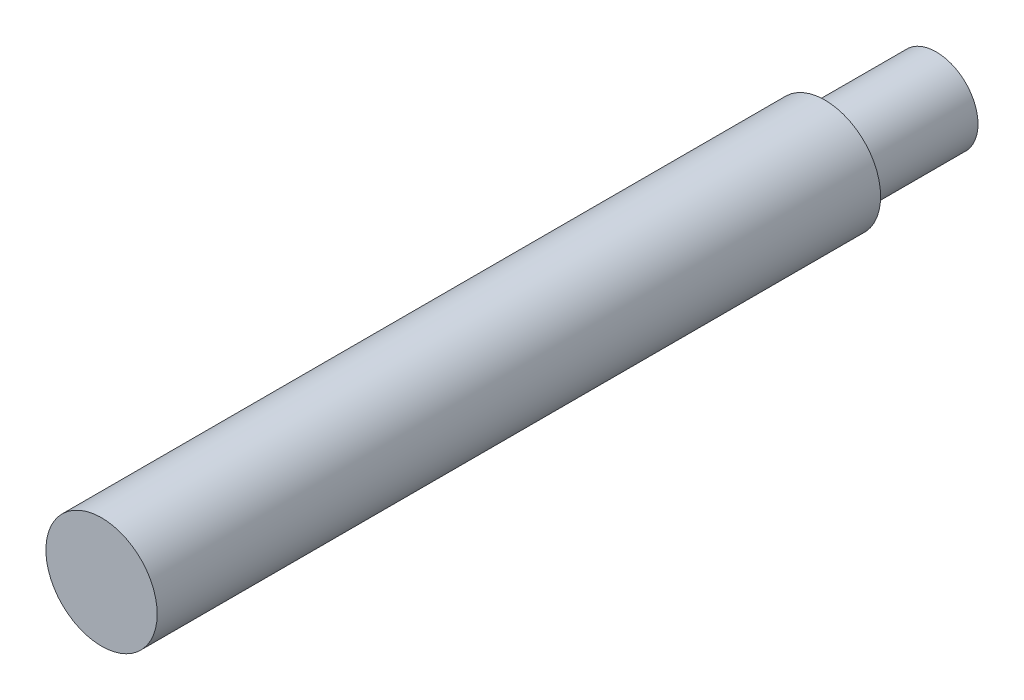
ISO-10303-21;
HEADER;
FILE_DESCRIPTION(('STEP AP214'),'2;1');
FILE_NAME('part.step','',(''),(''),'','','');
FILE_SCHEMA(('AUTOMOTIVE_DESIGN { 1 0 10303 214 1 1 1 1 }'));
ENDSEC;
DATA;
#1=APPLICATION_CONTEXT('core data for automotive mechanical design processes');
#2=APPLICATION_PROTOCOL_DEFINITION('international standard','automotive_design',2000,#1);
#3=PRODUCT_CONTEXT('',#1,'mechanical');
#4=PRODUCT('Part','Part','',(#3));
#5=PRODUCT_RELATED_PRODUCT_CATEGORY('part','',(#4));
#6=PRODUCT_DEFINITION_FORMATION('','',#4);
#7=PRODUCT_DEFINITION_CONTEXT('part definition',#1,'design');
#8=PRODUCT_DEFINITION('design','',#6,#7);
#9=PRODUCT_DEFINITION_SHAPE('','',#8);
#10=(LENGTH_UNIT() NAMED_UNIT(*) SI_UNIT(.MILLI.,.METRE.));
#11=(NAMED_UNIT(*) PLANE_ANGLE_UNIT() SI_UNIT($,.RADIAN.));
#12=(NAMED_UNIT(*) SI_UNIT($,.STERADIAN.) SOLID_ANGLE_UNIT());
#13=UNCERTAINTY_MEASURE_WITH_UNIT(LENGTH_MEASURE(1.E-05),#10,'distance_accuracy_value','');
#14=(GEOMETRIC_REPRESENTATION_CONTEXT(3) GLOBAL_UNCERTAINTY_ASSIGNED_CONTEXT((#13)) GLOBAL_UNIT_ASSIGNED_CONTEXT((#10,
#11,#12)) REPRESENTATION_CONTEXT('',''));
#15=CARTESIAN_POINT('',(0.,0.,0.));
#16=DIRECTION('',(0.,0.,1.));
#17=DIRECTION('',(1.,0.,0.));
#18=AXIS2_PLACEMENT_3D('',#15,#16,#17);
#19=CARTESIAN_POINT('',(0.,0.,0.));
#20=DIRECTION('',(0.,0.,1.));
#21=DIRECTION('',(1.,0.,0.));
#22=AXIS2_PLACEMENT_3D('',#19,#20,#21);
#23=PLANE('',#22);
#24=CARTESIAN_POINT('',(0.,0.,0.));
#25=DIRECTION('',(0.,0.,1.));
#26=DIRECTION('',(1.,0.,0.));
#27=AXIS2_PLACEMENT_3D('',#24,#25,#26);
#28=CIRCLE('',#27,12.7);
#29=CARTESIAN_POINT('',(12.7,0.,0.));
#30=VERTEX_POINT('',#29);
#31=EDGE_CURVE('E43',#30,#30,#28,.T.);
#32=ORIENTED_EDGE('',*,*,#31,.F.);
#33=EDGE_LOOP('',(#32));
#34=FACE_BOUND('',#33,.T.);
#35=CARTESIAN_POINT('',(0.,0.,0.));
#36=DIRECTION('',(0.,0.,1.));
#37=DIRECTION('',(1.,0.,0.));
#38=AXIS2_PLACEMENT_3D('',#35,#36,#37);
#39=CIRCLE('',#38,9.525);
#40=CARTESIAN_POINT('',(9.525,0.,0.));
#41=VERTEX_POINT('',#40);
#42=EDGE_CURVE('E10',#41,#41,#39,.F.);
#43=ORIENTED_EDGE('',*,*,#42,.F.);
#44=EDGE_LOOP('',(#43));
#45=FACE_BOUND('',#44,.T.);
#46=ADVANCED_FACE('F32',(#34,#45),#23,.F.);
#47=CARTESIAN_POINT('',(0.,0.,165.1));
#48=DIRECTION('',(0.,0.,-1.));
#49=DIRECTION('',(-1.,0.,0.));
#50=AXIS2_PLACEMENT_3D('',#47,#48,#49);
#51=CYLINDRICAL_SURFACE('',#50,12.7);
#52=CARTESIAN_POINT('',(0.,0.,165.1));
#53=DIRECTION('',(0.,0.,1.));
#54=DIRECTION('',(1.,0.,0.));
#55=AXIS2_PLACEMENT_3D('',#52,#53,#54);
#56=CIRCLE('',#55,12.7);
#57=CARTESIAN_POINT('',(12.7,0.,165.1));
#58=VERTEX_POINT('',#57);
#59=EDGE_CURVE('E39',#58,#58,#56,.T.);
#60=ORIENTED_EDGE('',*,*,#59,.F.);
#61=EDGE_LOOP('',(#60));
#62=FACE_BOUND('',#61,.T.);
#63=ORIENTED_EDGE('',*,*,#31,.T.);
#64=EDGE_LOOP('',(#63));
#65=FACE_BOUND('',#64,.T.);
#66=ADVANCED_FACE('F34',(#62,#65),#51,.T.);
#67=CARTESIAN_POINT('',(0.,0.,165.1));
#68=DIRECTION('',(0.,0.,1.));
#69=DIRECTION('',(1.,0.,0.));
#70=AXIS2_PLACEMENT_3D('',#67,#68,#69);
#71=PLANE('',#70);
#72=ORIENTED_EDGE('',*,*,#59,.T.);
#73=EDGE_LOOP('',(#72));
#74=FACE_BOUND('',#73,.T.);
#75=ADVANCED_FACE('F57',(#74),#71,.T.);
#76=CARTESIAN_POINT('',(0.,0.,-25.4));
#77=DIRECTION('',(0.,0.,1.));
#78=DIRECTION('',(1.,0.,0.));
#79=AXIS2_PLACEMENT_3D('',#76,#77,#78);
#80=CYLINDRICAL_SURFACE('',#79,9.525);
#81=CARTESIAN_POINT('',(0.,0.,-25.4));
#82=DIRECTION('',(0.,0.,-1.));
#83=DIRECTION('',(-1.,0.,0.));
#84=AXIS2_PLACEMENT_3D('',#81,#82,#83);
#85=CIRCLE('',#84,9.525);
#86=CARTESIAN_POINT('',(-9.525,0.,-25.4));
#87=VERTEX_POINT('',#86);
#88=EDGE_CURVE('E48',#87,#87,#85,.T.);
#89=ORIENTED_EDGE('',*,*,#88,.F.);
#90=EDGE_LOOP('',(#89));
#91=FACE_BOUND('',#90,.T.);
#92=ORIENTED_EDGE('',*,*,#42,.T.);
#93=EDGE_LOOP('',(#92));
#94=FACE_BOUND('',#93,.T.);
#95=ADVANCED_FACE('F55',(#91,#94),#80,.T.);
#96=CARTESIAN_POINT('',(0.,0.,-25.4));
#97=DIRECTION('',(0.,0.,-1.));
#98=DIRECTION('',(-1.,0.,0.));
#99=AXIS2_PLACEMENT_3D('',#96,#97,#98);
#100=PLANE('',#99);
#101=ORIENTED_EDGE('',*,*,#88,.T.);
#102=EDGE_LOOP('',(#101));
#103=FACE_BOUND('',#102,.T.);
#104=ADVANCED_FACE('F53',(#103),#100,.T.);
#105=CLOSED_SHELL('',(#46,#66,#75,#95,#104));
#106=MANIFOLD_SOLID_BREP('B2',#105);
#107=ADVANCED_BREP_SHAPE_REPRESENTATION('',(#18,#106),#14);
#108=SHAPE_DEFINITION_REPRESENTATION(#9,#107);
ENDSEC;
END-ISO-10303-21;
